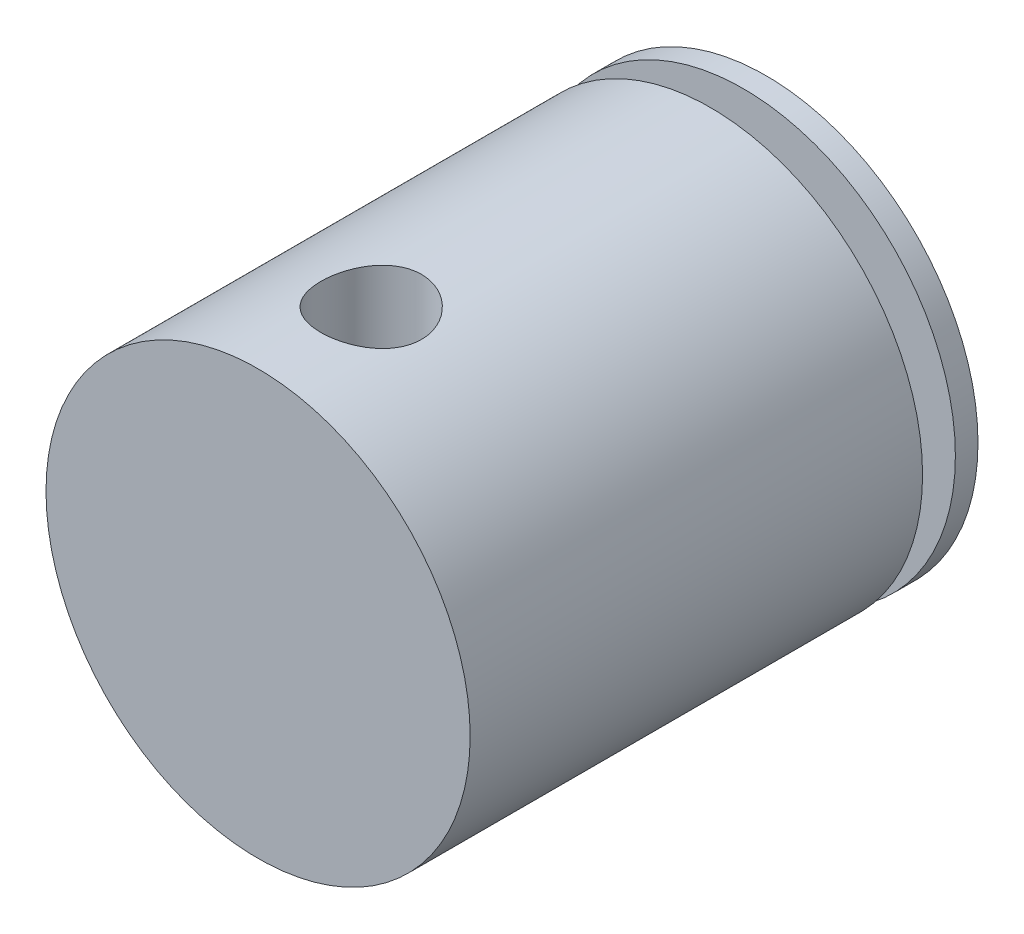
ISO-10303-21;
HEADER;
FILE_DESCRIPTION(('STEP AP214'),'2;1');
FILE_NAME('part.step','',(''),(''),'','','');
FILE_SCHEMA(('AUTOMOTIVE_DESIGN { 1 0 10303 214 1 1 1 1 }'));
ENDSEC;
DATA;
#1=APPLICATION_CONTEXT('core data for automotive mechanical design processes');
#2=APPLICATION_PROTOCOL_DEFINITION('international standard','automotive_design',2000,#1);
#3=PRODUCT_CONTEXT('',#1,'mechanical');
#4=PRODUCT('Part','Part','',(#3));
#5=PRODUCT_RELATED_PRODUCT_CATEGORY('part','',(#4));
#6=PRODUCT_DEFINITION_FORMATION('','',#4);
#7=PRODUCT_DEFINITION_CONTEXT('part definition',#1,'design');
#8=PRODUCT_DEFINITION('design','',#6,#7);
#9=PRODUCT_DEFINITION_SHAPE('','',#8);
#10=(LENGTH_UNIT() NAMED_UNIT(*) SI_UNIT(.MILLI.,.METRE.));
#11=(NAMED_UNIT(*) PLANE_ANGLE_UNIT() SI_UNIT($,.RADIAN.));
#12=(NAMED_UNIT(*) SI_UNIT($,.STERADIAN.) SOLID_ANGLE_UNIT());
#13=UNCERTAINTY_MEASURE_WITH_UNIT(LENGTH_MEASURE(1.E-05),#10,'distance_accuracy_value','');
#14=(GEOMETRIC_REPRESENTATION_CONTEXT(3) GLOBAL_UNCERTAINTY_ASSIGNED_CONTEXT((#13)) GLOBAL_UNIT_ASSIGNED_CONTEXT((#10,
#11,#12)) REPRESENTATION_CONTEXT('',''));
#15=CARTESIAN_POINT('',(0.,0.,0.));
#16=DIRECTION('',(0.,0.,1.));
#17=DIRECTION('',(1.,0.,0.));
#18=AXIS2_PLACEMENT_3D('',#15,#16,#17);
#19=CARTESIAN_POINT('',(0.,6.35,13.4366));
#20=DIRECTION('',(0.,-1.,0.));
#21=DIRECTION('',(0.,0.,-1.));
#22=AXIS2_PLACEMENT_3D('',#19,#20,#21);
#23=CYLINDRICAL_SURFACE('',#22,1.1303);
#24=CARTESIAN_POINT('',(0.632747022992577,1.89726519098149,12.50000548));
#25=CARTESIAN_POINT('',(0.584900384091897,1.91322023153208,12.4676836097554));
#26=CARTESIAN_POINT('',(0.534289547021317,1.92807974593231,12.4388357235473));
#27=CARTESIAN_POINT('',(0.428398847289024,1.95433793614678,12.3889930585579));
#28=CARTESIAN_POINT('',(0.373112896797203,1.96573200780675,12.3680087186983));
#29=CARTESIAN_POINT('',(0.258986731148002,1.98400039733528,12.3347621889654));
#30=CARTESIAN_POINT('',(0.200133362236899,1.99085671839388,12.3225347134511));
#31=CARTESIAN_POINT('',(0.080887997196954,1.99925142626344,12.307600560895));
#32=CARTESIAN_POINT('',(0.0204973438284298,2.00079430376887,12.3048858440438));
#33=CARTESIAN_POINT('',(-0.0958697663506059,1.99848935167467,12.308967704699));
#34=CARTESIAN_POINT('',(-0.151876162897505,1.99498814108088,12.3151526798096));
#35=CARTESIAN_POINT('',(-0.26193130348991,1.98354166038405,12.3356441747641));
#36=CARTESIAN_POINT('',(-0.315979140980776,1.97559435961155,12.3499544057128));
#37=CARTESIAN_POINT('',(-0.415618914149321,1.95692720364735,12.3842961410122));
#38=CARTESIAN_POINT('',(-0.461521104612107,1.94655405453876,12.4036321442156));
#39=CARTESIAN_POINT('',(-0.549861794115694,1.92346411692876,12.4478317185058));
#40=CARTESIAN_POINT('',(-0.592306364939444,1.91075157038218,12.4726853013118));
#41=CARTESIAN_POINT('',(-0.637878132503795,1.8955540395575,12.5034718634731));
#42=CARTESIAN_POINT('',(-0.64297698197121,1.89383043056443,12.5069779555065));
#43=CARTESIAN_POINT('',(-0.697195859847934,1.87525925626147,12.544920111092));
#44=CARTESIAN_POINT('',(-0.743419872006707,1.85727605918662,12.583105569346));
#45=CARTESIAN_POINT('',(-0.829247531867213,1.82058382274504,12.6662010561856));
#46=CARTESIAN_POINT('',(-0.868828452865083,1.80187255102614,12.7111332112984));
#47=CARTESIAN_POINT('',(-0.94436564099008,1.76355590563589,12.812000708802));
#48=CARTESIAN_POINT('',(-0.979507332424796,1.7440623349803,12.8685956926486));
#49=CARTESIAN_POINT('',(-1.03960286638491,1.70892622200437,12.9879891279861));
#50=CARTESIAN_POINT('',(-1.06457705785885,1.69327601286059,13.050774873313));
#51=CARTESIAN_POINT('',(-1.098929150276,1.67112600818607,13.1668572927225));
#52=CARTESIAN_POINT('',(-1.11051389830127,1.66337828843511,13.2192623034488));
#53=CARTESIAN_POINT('',(-1.12612343677336,1.65285291934652,13.3256606745058));
#54=CARTESIAN_POINT('',(-1.1301553654785,1.6500705772899,13.3796524860526));
#55=CARTESIAN_POINT('',(-1.13043715047446,1.64987752484841,13.487730079154));
#56=CARTESIAN_POINT('',(-1.12667756014645,1.65247333505932,13.5418158952475));
#57=CARTESIAN_POINT('',(-1.11157754288237,1.66266619280544,13.6484431824394));
#58=CARTESIAN_POINT('',(-1.100232114612,1.67026653977576,13.7009836107914));
#59=CARTESIAN_POINT('',(-1.07054504152151,1.68944513796008,13.8031196292429));
#60=CARTESIAN_POINT('',(-1.0522186017744,1.70101473849171,13.8527213506099));
#61=CARTESIAN_POINT('',(-1.00920142922363,1.72688308042955,13.9483039661418));
#62=CARTESIAN_POINT('',(-0.984508238216253,1.74118287540965,13.9942834527893));
#63=CARTESIAN_POINT('',(-0.924975356452469,1.77361896820926,14.0889789450019));
#64=CARTESIAN_POINT('',(-0.889151371211982,1.79200513320679,14.1369914483872));
#65=CARTESIAN_POINT('',(-0.810416620819579,1.82896223030409,14.2267725408132));
#66=CARTESIAN_POINT('',(-0.767499984114396,1.84753330340604,14.2685359015461));
#67=CARTESIAN_POINT('',(-0.670192119143001,1.88516083595998,14.3491971609545));
#68=CARTESIAN_POINT('',(-0.615060462129677,1.90405024434802,14.3872888348615));
#69=CARTESIAN_POINT('',(-0.498012866760856,1.93795493216013,14.4534934723028));
#70=CARTESIAN_POINT('',(-0.436101329040119,1.9529727035706,14.4816128589192));
#71=CARTESIAN_POINT('',(-0.311721642094349,1.97649520206688,14.5249169777376));
#72=CARTESIAN_POINT('',(-0.249595332293254,1.98538202079653,14.5408688726066));
#73=CARTESIAN_POINT('',(-0.123004674697715,1.99721829312216,14.5620130807818));
#74=CARTESIAN_POINT('',(-0.0585425924869632,2.00017335117725,14.5672155505199));
#75=CARTESIAN_POINT('',(0.062656316325467,1.99982343891763,14.5665931304865));
#76=CARTESIAN_POINT('',(0.11940625274167,1.99721667382654,14.561998206934));
#77=CARTESIAN_POINT('',(0.231178401450847,1.9873819760345,14.5444511656826));
#78=CARTESIAN_POINT('',(0.286200573368808,1.98015393542614,14.5314988528375));
#79=CARTESIAN_POINT('',(0.39268012554943,1.96180713715722,14.4979556513084));
#80=CARTESIAN_POINT('',(0.444161277657743,1.95071815775145,14.4774231551946));
#81=CARTESIAN_POINT('',(0.542991764074165,1.9255512955034,14.4294536218916));
#82=CARTESIAN_POINT('',(0.590340054023559,1.91147266025393,14.4020148462752));
#83=CARTESIAN_POINT('',(0.684849276287175,1.87981369631761,14.3377961124724));
#84=CARTESIAN_POINT('',(0.73148068874315,1.86202158583996,14.3003422057888));
#85=CARTESIAN_POINT('',(0.818158186611846,1.82560032678445,14.2187410604893));
#86=CARTESIAN_POINT('',(0.85819673684821,1.80697025099829,14.1745862724416));
#87=CARTESIAN_POINT('',(0.934916056666968,1.76859979097864,14.0752399898408));
#88=CARTESIAN_POINT('',(0.970775937983855,1.74895467301229,14.0193726728626));
#89=CARTESIAN_POINT('',(1.0324848313806,1.71325304331154,13.9013284900559));
#90=CARTESIAN_POINT('',(1.05834754691328,1.69719163213678,13.8391604095924));
#91=CARTESIAN_POINT('',(1.09452901881329,1.67402230547819,13.7237058222529));
#92=CARTESIAN_POINT('',(1.10697898900077,1.66573892427135,13.6713239161826));
#93=CARTESIAN_POINT('',(1.1242974383978,1.65410165857857,13.5648056619592));
#94=CARTESIAN_POINT('',(1.12917398487469,1.65074252895743,13.5106712434536));
#95=CARTESIAN_POINT('',(1.1310795961398,1.64943773149513,13.4021029796586));
#96=CARTESIAN_POINT('',(1.12809498489799,1.65150149783334,13.34766877717));
#97=CARTESIAN_POINT('',(1.11442794670077,1.66075255307469,13.240218649075));
#98=CARTESIAN_POINT('',(1.10374150993568,1.66794251081139,13.1872034771777));
#99=CARTESIAN_POINT('',(1.07537770864858,1.68636450680459,13.0845382150516));
#100=CARTESIAN_POINT('',(1.05778306281021,1.697548581326,13.034856168786));
#101=CARTESIAN_POINT('',(1.01621519753425,1.72275363069331,12.9389865147877));
#102=CARTESIAN_POINT('',(0.99223600618508,1.73677725861526,12.8928022309764));
#103=CARTESIAN_POINT('',(0.934321406956702,1.76869482931024,12.7977089775022));
#104=CARTESIAN_POINT('',(0.899421232332614,1.78685218118729,12.7494766079105));
#105=CARTESIAN_POINT('',(0.822641853733916,1.82347117608623,12.6592060295683));
#106=CARTESIAN_POINT('',(0.780774402611069,1.84193226027511,12.6171576106256));
#107=CARTESIAN_POINT('',(0.70304308462539,1.87268672022497,12.5505041857258));
#108=CARTESIAN_POINT('',(0.66867431918063,1.8852847994488,12.5242754691217));
#109=CARTESIAN_POINT('',(0.632747022992577,1.89726519098149,12.50000548));
#110=B_SPLINE_CURVE_WITH_KNOTS('',3,(#24,#25,#26,#27,#28,#29,#30,#31,#32,#33,#34,#35,#36,#37,
#38,#39,#40,#41,#42,#43,#44,#45,#46,#47,#48,#49,#50,#51,#52,#53,#54,#55,#56,#57,#58,#59,#60,#61,
#62,#63,#64,#65,#66,#67,#68,#69,#70,#71,#72,#73,#74,#75,#76,#77,#78,#79,#80,#81,#82,#83,#84,#85,
#86,#87,#88,#89,#90,#91,#92,#93,#94,#95,#96,#97,#98,#99,#100,#101,#102,#103,#104,#105,#106,#107,
#108,#109),.UNSPECIFIED.,.T.,.F.,(4,2,2,2,2,2,2,2,2,2,2,2,2,2,2,2,2,2,2,2,2,2,2,2,2,2,2,2,2,2,2,
2,2,2,2,2,2,2,2,2,2,2,4),(0.,0.179586584175892,0.359410733480006,0.539943862083115,
0.720324374338658,0.888884851848265,1.05752237916461,1.20968525886804,1.3615748975831,
1.38084665050172,1.56776038509219,1.75530108263773,1.96249593717728,2.16927405477266,
2.33124806623797,2.4930689167748,2.65508607744691,2.81721016131446,2.97898312951322,
3.14081865205979,3.32805940938032,3.51545595502382,3.72324267489828,3.93089531665479,
4.12402330624869,4.3169687381834,4.48712343381739,4.65728210273182,4.82615644275631,
4.99507333388996,5.18152246315155,5.36818323330793,5.57486681410519,5.78126607350657,
5.94398659181126,6.10653365983107,6.26936369714682,6.43227857013588,6.59329944573043,
6.75447146776875,6.94047652363428,7.12617093691003,7.261019706841),.UNSPECIFIED.);
#111=CARTESIAN_POINT('',(0.632747022992577,1.89726519098149,12.50000548));
#112=VERTEX_POINT('',#111);
#113=EDGE_CURVE('E10',#112,#112,#110,.T.);
#114=ORIENTED_EDGE('',*,*,#113,.F.);
#115=EDGE_LOOP('',(#114));
#116=FACE_BOUND('',#115,.T.);
#117=CARTESIAN_POINT('',(0.,4.7625,12.3063));
#118=CARTESIAN_POINT('',(-0.0625504471650141,4.76249888658254,12.3063019276085));
#119=CARTESIAN_POINT('',(-0.125123129283414,4.76125531619252,12.3115097817071));
#120=CARTESIAN_POINT('',(-0.248481844038289,4.75641479439014,12.3321764396431));
#121=CARTESIAN_POINT('',(-0.309266728250474,4.75281636336277,12.3476416885284));
#122=CARTESIAN_POINT('',(-0.427250047842577,4.74366551356278,12.3883041375215));
#123=CARTESIAN_POINT('',(-0.484452471724358,4.73811531503235,12.4134902827412));
#124=CARTESIAN_POINT('',(-0.593819309373726,4.72565533763748,12.4728422515937));
#125=CARTESIAN_POINT('',(-0.64598367695744,4.71874554631143,12.5070081575333));
#126=CARTESIAN_POINT('',(-0.744769781920519,4.70417494660862,12.5840251121215));
#127=CARTESIAN_POINT('',(-0.791283867055919,4.69650348465821,12.6270122351177));
#128=CARTESIAN_POINT('',(-0.876514301242985,4.68134670992166,12.7201597081509));
#129=CARTESIAN_POINT('',(-0.915229851617918,4.67386141627045,12.7703207920009));
#130=CARTESIAN_POINT('',(-0.984257303274577,4.65981813018725,12.8772113977317));
#131=CARTESIAN_POINT('',(-1.01445122919644,4.6532737183417,12.9340190505402));
#132=CARTESIAN_POINT('',(-1.06482048280172,4.64200756588757,13.0520837123328));
#133=CARTESIAN_POINT('',(-1.08499723988879,4.63728556525076,13.1133400850745));
#134=CARTESIAN_POINT('',(-1.11439695837541,4.63030798184956,13.2373860966354));
#135=CARTESIAN_POINT('',(-1.12381226659385,4.62800914824604,13.3001276604933));
#136=CARTESIAN_POINT('',(-1.13202052695981,4.62600854277725,13.4263386764494));
#137=CARTESIAN_POINT('',(-1.13081502726521,4.62630639240253,13.4898080211146));
#138=CARTESIAN_POINT('',(-1.11796991019264,4.62942650333921,13.6142176487548));
#139=CARTESIAN_POINT('',(-1.10655703472154,4.63219390421103,13.6751829305462));
#140=CARTESIAN_POINT('',(-1.07398179717216,4.63985416565765,13.7943079068008));
#141=CARTESIAN_POINT('',(-1.05281880205468,4.64474716423846,13.8524674188249));
#142=CARTESIAN_POINT('',(-1.00114461591174,4.65615920388045,13.9649502308673));
#143=CARTESIAN_POINT('',(-0.970549092235666,4.66269281104616,14.0192332491175));
#144=CARTESIAN_POINT('',(-0.900937448372107,4.6766413798207,14.1219771959224));
#145=CARTESIAN_POINT('',(-0.861919990000872,4.68405648140832,14.1704371973354));
#146=CARTESIAN_POINT('',(-0.775386694919824,4.69916539760802,14.2614615109683));
#147=CARTESIAN_POINT('',(-0.727678881710192,4.70686148789115,14.3038431496225));
#148=CARTESIAN_POINT('',(-0.62574265459869,4.72149336042035,14.3800369726125));
#149=CARTESIAN_POINT('',(-0.571514078356703,4.72842912372918,14.4138489435339));
#150=CARTESIAN_POINT('',(-0.457830918707983,4.7407880498009,14.4720013650433));
#151=CARTESIAN_POINT('',(-0.398361889110952,4.7462068476709,14.49631456182));
#152=CARTESIAN_POINT('',(-0.276024255491215,4.75488931700388,14.5345498440921));
#153=CARTESIAN_POINT('',(-0.213156237830652,4.75815335891023,14.5484737157628));
#154=CARTESIAN_POINT('',(-0.0873691590361529,4.76210460266796,14.5652617208301));
#155=CARTESIAN_POINT('',(-0.0244851159606706,4.76284982691246,14.5683749309216));
#156=CARTESIAN_POINT('',(0.100904914262536,4.76184360723796,14.5641330105785));
#157=CARTESIAN_POINT('',(0.16341093147156,4.76009236453545,14.5567787238294));
#158=CARTESIAN_POINT('',(0.285421966304749,4.7543269344029,14.5320164653175));
#159=CARTESIAN_POINT('',(0.344955665814234,4.75034285425274,14.5147421786054));
#160=CARTESIAN_POINT('',(0.460278770394104,4.74055923690497,14.4707811543474));
#161=CARTESIAN_POINT('',(0.516067819691339,4.73475952750301,14.4440935239573));
#162=CARTESIAN_POINT('',(0.623325436186189,4.72184709836335,14.3815655374685));
#163=CARTESIAN_POINT('',(0.674708549514261,4.71471447952687,14.3455828028546));
#164=CARTESIAN_POINT('',(0.770796159921669,4.69996242077331,14.2656702732492));
#165=CARTESIAN_POINT('',(0.81549962259093,4.69234290571582,14.2217392497106));
#166=CARTESIAN_POINT('',(0.897968165505128,4.6772704338935,14.1260258874936));
#167=CARTESIAN_POINT('',(0.935559392964994,4.66982480514445,14.0740923671793));
#168=CARTESIAN_POINT('',(1.00149022808019,4.65613164810589,13.9645050438674));
#169=CARTESIAN_POINT('',(1.0298302497261,4.64988406620905,13.906851496991));
#170=CARTESIAN_POINT('',(1.07624913236191,4.63935996173661,13.7877754030212));
#171=CARTESIAN_POINT('',(1.0943883213257,4.63507187952516,13.7263774471342));
#172=CARTESIAN_POINT('',(1.12005827002546,4.62893650286401,13.6012877932594));
#173=CARTESIAN_POINT('',(1.12759108086313,4.62708873650105,13.537596541202));
#174=CARTESIAN_POINT('',(1.13173541942955,4.62607660378741,13.4114902196367));
#175=CARTESIAN_POINT('',(1.12862381464116,4.62684420801562,13.3490846415471));
#176=CARTESIAN_POINT('',(1.11219513075476,4.63082047949845,13.225714932912));
#177=CARTESIAN_POINT('',(1.09887821898312,4.63402910673,13.1647507787498));
#178=CARTESIAN_POINT('',(1.06256106322215,4.64248992098927,13.046261431108));
#179=CARTESIAN_POINT('',(1.03960787796393,4.64773216751233,12.9887210561912));
#180=CARTESIAN_POINT('',(0.984707919621944,4.65967190423072,12.8782692678741));
#181=CARTESIAN_POINT('',(0.952760024881786,4.66636957589639,12.8253584328649));
#182=CARTESIAN_POINT('',(0.879888490013006,4.68066337542781,12.7243182791499));
#183=CARTESIAN_POINT('',(0.838770514374275,4.68827700003746,12.6763315675736));
#184=CARTESIAN_POINT('',(0.749111183772158,4.7034351287937,12.5878488324981));
#185=CARTESIAN_POINT('',(0.700568092234972,4.710979616332,12.5473545662278));
#186=CARTESIAN_POINT('',(0.596506539598594,4.72529205111388,12.4743836431116));
#187=CARTESIAN_POINT('',(0.540889568123423,4.73204576758136,12.4420444881268));
#188=CARTESIAN_POINT('',(0.424856108392299,4.74386898028089,12.3872260472068));
#189=CARTESIAN_POINT('',(0.364443352132301,4.7489397705207,12.3647391815334));
#190=CARTESIAN_POINT('',(0.253386137402231,4.75601012346783,12.3338864600197));
#191=CARTESIAN_POINT('',(0.203302998812329,4.75842781496556,12.3235627629292));
#192=CARTESIAN_POINT('',(0.102151476578725,4.76167315947544,12.3097689544463));
#193=CARTESIAN_POINT('',(0.0510831531122653,4.76250090929606,12.3062984257775));
#194=CARTESIAN_POINT('',(0.,4.7625,12.3063));
#195=B_SPLINE_CURVE_WITH_KNOTS('',3,(#117,#118,#119,#120,#121,#122,#123,#124,#125,#126,#127,
#128,#129,#130,#131,#132,#133,#134,#135,#136,#137,#138,#139,#140,#141,#142,#143,#144,#145,#146,
#147,#148,#149,#150,#151,#152,#153,#154,#155,#156,#157,#158,#159,#160,#161,#162,#163,#164,#165,
#166,#167,#168,#169,#170,#171,#172,#173,#174,#175,#176,#177,#178,#179,#180,#181,#182,#183,#184,
#185,#186,#187,#188,#189,#190,#191,#192,#193,#194),.UNSPECIFIED.,.T.,.F.,(4,2,2,2,2,2,2,2,2,2,2,
2,2,2,2,2,2,2,2,2,2,2,2,2,2,2,2,2,2,2,2,2,2,2,2,2,2,2,4),(0.,0.187464233445308,
0.375046368371234,0.562415804978719,0.749786959039266,0.940301149532557,1.13083484137835,
1.323889669599,1.51691694186557,1.70643733003011,1.89593009293011,2.08131531006457,
2.26671256527165,2.4538179686575,2.64095312363527,2.83287860741468,3.02480887033709,
3.21728584337239,3.4097297173464,3.59770916783967,3.78567346795128,3.97116223372724,
4.15666859761835,4.34520498082457,4.53377053056524,4.72647545534149,4.9191717554081,
5.11071612615483,5.30222345023359,5.48878783947735,5.67534916987401,5.86100983556771,
6.04669366374175,6.23676713117169,6.4268851208331,6.6200215835062,6.81300919697153,
6.96611517316015,7.11921182672838),.UNSPECIFIED.);
#196=CARTESIAN_POINT('',(0.,4.7625,12.3063));
#197=VERTEX_POINT('',#196);
#198=EDGE_CURVE('E105',#197,#197,#195,.T.);
#199=ORIENTED_EDGE('',*,*,#198,.T.);
#200=EDGE_LOOP('',(#199));
#201=FACE_BOUND('',#200,.T.);
#202=ADVANCED_FACE('F37',(#116,#201),#23,.F.);
#203=CARTESIAN_POINT('',(0.,0.,5.08));
#204=DIRECTION('',(0.,0.,-1.));
#205=DIRECTION('',(-1.,0.,0.));
#206=AXIS2_PLACEMENT_3D('',#203,#204,#205);
#207=CYLINDRICAL_SURFACE('',#206,4.7625);
#208=CARTESIAN_POINT('',(0.,0.,5.08));
#209=DIRECTION('',(0.,0.,1.));
#210=DIRECTION('',(1.,0.,0.));
#211=AXIS2_PLACEMENT_3D('',#208,#209,#210);
#212=CIRCLE('',#211,4.7625);
#213=CARTESIAN_POINT('',(4.7625,0.,5.08));
#214=VERTEX_POINT('',#213);
#215=EDGE_CURVE('E117',#214,#214,#212,.T.);
#216=ORIENTED_EDGE('',*,*,#215,.F.);
#217=EDGE_LOOP('',(#216));
#218=FACE_BOUND('',#217,.T.);
#219=CARTESIAN_POINT('',(0.,0.,4.572));
#220=DIRECTION('',(0.,0.,-1.));
#221=DIRECTION('',(-1.,0.,0.));
#222=AXIS2_PLACEMENT_3D('',#219,#220,#221);
#223=CIRCLE('',#222,4.7625);
#224=CARTESIAN_POINT('',(-4.7625,0.,4.572));
#225=VERTEX_POINT('',#224);
#226=EDGE_CURVE('E112',#225,#225,#223,.T.);
#227=ORIENTED_EDGE('',*,*,#226,.F.);
#228=EDGE_LOOP('',(#227));
#229=FACE_BOUND('',#228,.T.);
#230=ADVANCED_FACE('F39',(#218,#229),#207,.T.);
#231=CARTESIAN_POINT('',(0.,0.,12.50000548));
#232=DIRECTION('',(0.,0.,-1.));
#233=DIRECTION('',(-1.,0.,0.));
#234=AXIS2_PLACEMENT_3D('',#231,#232,#233);
#235=CYLINDRICAL_SURFACE('',#234,1.999996);
#236=CARTESIAN_POINT('',(-0.632747022992577,-1.89726519098149,12.50000548));
#237=CARTESIAN_POINT('',(-0.584900384091897,-1.91322023153208,12.4676836097554));
#238=CARTESIAN_POINT('',(-0.534289547021317,-1.92807974593231,12.4388357235473));
#239=CARTESIAN_POINT('',(-0.428398847289024,-1.95433793614678,12.3889930585579));
#240=CARTESIAN_POINT('',(-0.373112896797203,-1.96573200780675,12.3680087186983));
#241=CARTESIAN_POINT('',(-0.258986731148002,-1.98400039733528,12.3347621889654));
#242=CARTESIAN_POINT('',(-0.200133362236899,-1.99085671839388,12.3225347134511));
#243=CARTESIAN_POINT('',(-0.080887997196954,-1.99925142626344,12.307600560895));
#244=CARTESIAN_POINT('',(-0.0204973438284298,-2.00079430376887,12.3048858440438));
#245=CARTESIAN_POINT('',(0.0958697663506059,-1.99848935167467,12.308967704699));
#246=CARTESIAN_POINT('',(0.151876162897505,-1.99498814108088,12.3151526798096));
#247=CARTESIAN_POINT('',(0.26193130348991,-1.98354166038405,12.3356441747641));
#248=CARTESIAN_POINT('',(0.315979140980776,-1.97559435961155,12.3499544057128));
#249=CARTESIAN_POINT('',(0.415618914149321,-1.95692720364735,12.3842961410122));
#250=CARTESIAN_POINT('',(0.461521104612107,-1.94655405453876,12.4036321442156));
#251=CARTESIAN_POINT('',(0.549861794115694,-1.92346411692876,12.4478317185058));
#252=CARTESIAN_POINT('',(0.592306364939444,-1.91075157038218,12.4726853013118));
#253=CARTESIAN_POINT('',(0.637878132503795,-1.8955540395575,12.5034718634731));
#254=CARTESIAN_POINT('',(0.64297698197121,-1.89383043056443,12.5069779555065));
#255=CARTESIAN_POINT('',(0.697195859847934,-1.87525925626147,12.544920111092));
#256=CARTESIAN_POINT('',(0.743419872006707,-1.85727605918662,12.583105569346));
#257=CARTESIAN_POINT('',(0.829247531867213,-1.82058382274504,12.6662010561856));
#258=CARTESIAN_POINT('',(0.868828452865083,-1.80187255102614,12.7111332112984));
#259=CARTESIAN_POINT('',(0.94436564099008,-1.76355590563589,12.812000708802));
#260=CARTESIAN_POINT('',(0.979507332424796,-1.7440623349803,12.8685956926486));
#261=CARTESIAN_POINT('',(1.03960286638491,-1.70892622200437,12.9879891279861));
#262=CARTESIAN_POINT('',(1.06457705785885,-1.69327601286059,13.050774873313));
#263=CARTESIAN_POINT('',(1.098929150276,-1.67112600818607,13.1668572927225));
#264=CARTESIAN_POINT('',(1.11051389830127,-1.66337828843511,13.2192623034488));
#265=CARTESIAN_POINT('',(1.12612343677336,-1.65285291934652,13.3256606745058));
#266=CARTESIAN_POINT('',(1.1301553654785,-1.6500705772899,13.3796524860526));
#267=CARTESIAN_POINT('',(1.13043715047446,-1.64987752484841,13.487730079154));
#268=CARTESIAN_POINT('',(1.12667756014645,-1.65247333505932,13.5418158952475));
#269=CARTESIAN_POINT('',(1.11157754288237,-1.66266619280544,13.6484431824394));
#270=CARTESIAN_POINT('',(1.100232114612,-1.67026653977576,13.7009836107914));
#271=CARTESIAN_POINT('',(1.07054504152151,-1.68944513796008,13.8031196292429));
#272=CARTESIAN_POINT('',(1.0522186017744,-1.70101473849171,13.8527213506099));
#273=CARTESIAN_POINT('',(1.00920142922363,-1.72688308042955,13.9483039661418));
#274=CARTESIAN_POINT('',(0.984508238216253,-1.74118287540965,13.9942834527893));
#275=CARTESIAN_POINT('',(0.924975356452469,-1.77361896820926,14.0889789450019));
#276=CARTESIAN_POINT('',(0.889151371211982,-1.79200513320679,14.1369914483872));
#277=CARTESIAN_POINT('',(0.810416620819579,-1.82896223030409,14.2267725408132));
#278=CARTESIAN_POINT('',(0.767499984114396,-1.84753330340604,14.2685359015461));
#279=CARTESIAN_POINT('',(0.670192119143001,-1.88516083595998,14.3491971609545));
#280=CARTESIAN_POINT('',(0.615060462129677,-1.90405024434802,14.3872888348615));
#281=CARTESIAN_POINT('',(0.498012866760856,-1.93795493216013,14.4534934723028));
#282=CARTESIAN_POINT('',(0.436101329040119,-1.9529727035706,14.4816128589192));
#283=CARTESIAN_POINT('',(0.311721642094349,-1.97649520206688,14.5249169777376));
#284=CARTESIAN_POINT('',(0.249595332293254,-1.98538202079653,14.5408688726066));
#285=CARTESIAN_POINT('',(0.123004674697715,-1.99721829312216,14.5620130807818));
#286=CARTESIAN_POINT('',(0.0585425924869632,-2.00017335117725,14.5672155505199));
#287=CARTESIAN_POINT('',(-0.062656316325467,-1.99982343891763,14.5665931304865));
#288=CARTESIAN_POINT('',(-0.11940625274167,-1.99721667382654,14.561998206934));
#289=CARTESIAN_POINT('',(-0.231178401450847,-1.9873819760345,14.5444511656826));
#290=CARTESIAN_POINT('',(-0.286200573368808,-1.98015393542614,14.5314988528375));
#291=CARTESIAN_POINT('',(-0.39268012554943,-1.96180713715722,14.4979556513084));
#292=CARTESIAN_POINT('',(-0.444161277657743,-1.95071815775145,14.4774231551946));
#293=CARTESIAN_POINT('',(-0.542991764074165,-1.9255512955034,14.4294536218916));
#294=CARTESIAN_POINT('',(-0.590340054023559,-1.91147266025393,14.4020148462752));
#295=CARTESIAN_POINT('',(-0.684849276287175,-1.87981369631761,14.3377961124724));
#296=CARTESIAN_POINT('',(-0.73148068874315,-1.86202158583996,14.3003422057888));
#297=CARTESIAN_POINT('',(-0.818158186611846,-1.82560032678445,14.2187410604893));
#298=CARTESIAN_POINT('',(-0.85819673684821,-1.80697025099829,14.1745862724416));
#299=CARTESIAN_POINT('',(-0.934916056666968,-1.76859979097864,14.0752399898408));
#300=CARTESIAN_POINT('',(-0.970775937983855,-1.74895467301229,14.0193726728626));
#301=CARTESIAN_POINT('',(-1.0324848313806,-1.71325304331154,13.9013284900559));
#302=CARTESIAN_POINT('',(-1.05834754691328,-1.69719163213678,13.8391604095924));
#303=CARTESIAN_POINT('',(-1.09452901881329,-1.67402230547819,13.7237058222529));
#304=CARTESIAN_POINT('',(-1.10697898900077,-1.66573892427135,13.6713239161826));
#305=CARTESIAN_POINT('',(-1.1242974383978,-1.65410165857857,13.5648056619592));
#306=CARTESIAN_POINT('',(-1.12917398487469,-1.65074252895743,13.5106712434536));
#307=CARTESIAN_POINT('',(-1.1310795961398,-1.64943773149513,13.4021029796586));
#308=CARTESIAN_POINT('',(-1.12809498489799,-1.65150149783334,13.34766877717));
#309=CARTESIAN_POINT('',(-1.11442794670077,-1.66075255307469,13.240218649075));
#310=CARTESIAN_POINT('',(-1.10374150993568,-1.66794251081139,13.1872034771777));
#311=CARTESIAN_POINT('',(-1.07537770864858,-1.68636450680459,13.0845382150516));
#312=CARTESIAN_POINT('',(-1.05778306281021,-1.697548581326,13.034856168786));
#313=CARTESIAN_POINT('',(-1.01621519753425,-1.72275363069331,12.9389865147877));
#314=CARTESIAN_POINT('',(-0.99223600618508,-1.73677725861526,12.8928022309764));
#315=CARTESIAN_POINT('',(-0.934321406956702,-1.76869482931024,12.7977089775022));
#316=CARTESIAN_POINT('',(-0.899421232332614,-1.78685218118729,12.7494766079105));
#317=CARTESIAN_POINT('',(-0.822641853733916,-1.82347117608623,12.6592060295683));
#318=CARTESIAN_POINT('',(-0.780774402611069,-1.84193226027511,12.6171576106256));
#319=CARTESIAN_POINT('',(-0.70304308462539,-1.87268672022497,12.5505041857258));
#320=CARTESIAN_POINT('',(-0.66867431918063,-1.8852847994488,12.5242754691217));
#321=CARTESIAN_POINT('',(-0.632747022992577,-1.89726519098149,12.50000548));
#322=B_SPLINE_CURVE_WITH_KNOTS('',3,(#236,#237,#238,#239,#240,#241,#242,#243,#244,#245,#246,
#247,#248,#249,#250,#251,#252,#253,#254,#255,#256,#257,#258,#259,#260,#261,#262,#263,#264,#265,
#266,#267,#268,#269,#270,#271,#272,#273,#274,#275,#276,#277,#278,#279,#280,#281,#282,#283,#284,
#285,#286,#287,#288,#289,#290,#291,#292,#293,#294,#295,#296,#297,#298,#299,#300,#301,#302,#303,
#304,#305,#306,#307,#308,#309,#310,#311,#312,#313,#314,#315,#316,#317,#318,#319,#320,#321),
.UNSPECIFIED.,.T.,.F.,(4,2,2,2,2,2,2,2,2,2,2,2,2,2,2,2,2,2,2,2,2,2,2,2,2,2,2,2,2,2,2,2,2,2,2,2,
2,2,2,2,2,2,4),(0.,0.179586584175892,0.359410733480006,0.539943862083115,0.720324374338658,
0.888884851848265,1.05752237916461,1.20968525886804,1.3615748975831,1.38084665050172,
1.56776038509219,1.75530108263773,1.96249593717728,2.16927405477266,2.33124806623797,
2.4930689167748,2.65508607744691,2.81721016131446,2.97898312951322,3.14081865205979,
3.32805940938032,3.51545595502382,3.72324267489828,3.93089531665479,4.12402330624869,
4.3169687381834,4.48712343381739,4.65728210273182,4.82615644275631,4.99507333388996,
5.18152246315155,5.36818323330793,5.57486681410519,5.78126607350657,5.94398659181126,
6.10653365983107,6.26936369714682,6.43227857013588,6.59329944573043,6.75447146776875,
6.94047652363428,7.12617093691003,7.261019706841),.UNSPECIFIED.);
#323=CARTESIAN_POINT('',(-0.632747022992577,-1.89726519098149,12.50000548));
#324=VERTEX_POINT('',#323);
#325=EDGE_CURVE('E46',#324,#324,#322,.T.);
#326=ORIENTED_EDGE('',*,*,#325,.T.);
#327=EDGE_LOOP('',(#326));
#328=FACE_BOUND('',#327,.T.);
#329=ORIENTED_EDGE('',*,*,#113,.T.);
#330=EDGE_LOOP('',(#329));
#331=FACE_BOUND('',#330,.T.);
#332=CARTESIAN_POINT('',(0.,0.,4.572));
#333=DIRECTION('',(0.,0.,-1.));
#334=DIRECTION('',(-1.,0.,0.));
#335=AXIS2_PLACEMENT_3D('',#332,#333,#334);
#336=CIRCLE('',#335,1.999996);
#337=CARTESIAN_POINT('',(-1.999996,0.,4.572));
#338=VERTEX_POINT('',#337);
#339=EDGE_CURVE('E41',#338,#338,#336,.F.);
#340=ORIENTED_EDGE('',*,*,#339,.F.);
#341=EDGE_LOOP('',(#340));
#342=FACE_BOUND('',#341,.T.);
#343=CARTESIAN_POINT('',(0.,0.,14.5720054));
#344=DIRECTION('',(0.,0.,-1.));
#345=DIRECTION('',(-1.,0.,0.));
#346=AXIS2_PLACEMENT_3D('',#343,#344,#345);
#347=CIRCLE('',#346,1.999996);
#348=CARTESIAN_POINT('',(-1.999996,0.,14.5720054));
#349=VERTEX_POINT('',#348);
#350=EDGE_CURVE('E158',#349,#349,#347,.T.);
#351=ORIENTED_EDGE('',*,*,#350,.F.);
#352=EDGE_LOOP('',(#351));
#353=FACE_BOUND('',#352,.T.);
#354=ADVANCED_FACE('F65',(#328,#331,#342,#353),#235,.F.);
#355=ORIENTED_EDGE('',*,*,#325,.F.);
#356=EDGE_LOOP('',(#355));
#357=FACE_BOUND('',#356,.T.);
#358=CARTESIAN_POINT('',(0.,-4.7625,12.3063));
#359=CARTESIAN_POINT('',(0.0625504471650141,-4.76249888658254,12.3063019276085));
#360=CARTESIAN_POINT('',(0.125123129283414,-4.76125531619252,12.3115097817071));
#361=CARTESIAN_POINT('',(0.248481844038289,-4.75641479439014,12.3321764396431));
#362=CARTESIAN_POINT('',(0.309266728250474,-4.75281636336277,12.3476416885284));
#363=CARTESIAN_POINT('',(0.427250047842577,-4.74366551356278,12.3883041375215));
#364=CARTESIAN_POINT('',(0.484452471724358,-4.73811531503235,12.4134902827412));
#365=CARTESIAN_POINT('',(0.593819309373726,-4.72565533763748,12.4728422515937));
#366=CARTESIAN_POINT('',(0.64598367695744,-4.71874554631143,12.5070081575333));
#367=CARTESIAN_POINT('',(0.744769781920519,-4.70417494660862,12.5840251121215));
#368=CARTESIAN_POINT('',(0.791283867055919,-4.69650348465821,12.6270122351177));
#369=CARTESIAN_POINT('',(0.876514301242985,-4.68134670992166,12.7201597081509));
#370=CARTESIAN_POINT('',(0.915229851617918,-4.67386141627045,12.7703207920009));
#371=CARTESIAN_POINT('',(0.984257303274577,-4.65981813018725,12.8772113977317));
#372=CARTESIAN_POINT('',(1.01445122919644,-4.6532737183417,12.9340190505402));
#373=CARTESIAN_POINT('',(1.06482048280172,-4.64200756588757,13.0520837123328));
#374=CARTESIAN_POINT('',(1.08499723988879,-4.63728556525076,13.1133400850745));
#375=CARTESIAN_POINT('',(1.11439695837541,-4.63030798184956,13.2373860966354));
#376=CARTESIAN_POINT('',(1.12381226659385,-4.62800914824604,13.3001276604933));
#377=CARTESIAN_POINT('',(1.13202052695981,-4.62600854277725,13.4263386764494));
#378=CARTESIAN_POINT('',(1.13081502726521,-4.62630639240253,13.4898080211146));
#379=CARTESIAN_POINT('',(1.11796991019264,-4.62942650333921,13.6142176487548));
#380=CARTESIAN_POINT('',(1.10655703472154,-4.63219390421103,13.6751829305462));
#381=CARTESIAN_POINT('',(1.07398179717216,-4.63985416565765,13.7943079068008));
#382=CARTESIAN_POINT('',(1.05281880205468,-4.64474716423846,13.8524674188249));
#383=CARTESIAN_POINT('',(1.00114461591174,-4.65615920388045,13.9649502308673));
#384=CARTESIAN_POINT('',(0.970549092235666,-4.66269281104616,14.0192332491175));
#385=CARTESIAN_POINT('',(0.900937448372107,-4.6766413798207,14.1219771959224));
#386=CARTESIAN_POINT('',(0.861919990000872,-4.68405648140832,14.1704371973354));
#387=CARTESIAN_POINT('',(0.775386694919824,-4.69916539760802,14.2614615109683));
#388=CARTESIAN_POINT('',(0.727678881710192,-4.70686148789115,14.3038431496225));
#389=CARTESIAN_POINT('',(0.62574265459869,-4.72149336042035,14.3800369726125));
#390=CARTESIAN_POINT('',(0.571514078356703,-4.72842912372918,14.4138489435339));
#391=CARTESIAN_POINT('',(0.457830918707983,-4.7407880498009,14.4720013650433));
#392=CARTESIAN_POINT('',(0.398361889110952,-4.7462068476709,14.49631456182));
#393=CARTESIAN_POINT('',(0.276024255491215,-4.75488931700388,14.5345498440921));
#394=CARTESIAN_POINT('',(0.213156237830652,-4.75815335891023,14.5484737157628));
#395=CARTESIAN_POINT('',(0.0873691590361529,-4.76210460266796,14.5652617208301));
#396=CARTESIAN_POINT('',(0.0244851159606706,-4.76284982691246,14.5683749309216));
#397=CARTESIAN_POINT('',(-0.100904914262536,-4.76184360723796,14.5641330105785));
#398=CARTESIAN_POINT('',(-0.16341093147156,-4.76009236453545,14.5567787238294));
#399=CARTESIAN_POINT('',(-0.285421966304749,-4.7543269344029,14.5320164653175));
#400=CARTESIAN_POINT('',(-0.344955665814234,-4.75034285425274,14.5147421786054));
#401=CARTESIAN_POINT('',(-0.460278770394104,-4.74055923690497,14.4707811543474));
#402=CARTESIAN_POINT('',(-0.516067819691339,-4.73475952750301,14.4440935239573));
#403=CARTESIAN_POINT('',(-0.623325436186189,-4.72184709836335,14.3815655374685));
#404=CARTESIAN_POINT('',(-0.674708549514261,-4.71471447952687,14.3455828028546));
#405=CARTESIAN_POINT('',(-0.770796159921669,-4.69996242077331,14.2656702732492));
#406=CARTESIAN_POINT('',(-0.81549962259093,-4.69234290571582,14.2217392497106));
#407=CARTESIAN_POINT('',(-0.897968165505128,-4.6772704338935,14.1260258874936));
#408=CARTESIAN_POINT('',(-0.935559392964994,-4.66982480514445,14.0740923671793));
#409=CARTESIAN_POINT('',(-1.00149022808019,-4.65613164810589,13.9645050438674));
#410=CARTESIAN_POINT('',(-1.0298302497261,-4.64988406620905,13.906851496991));
#411=CARTESIAN_POINT('',(-1.07624913236191,-4.63935996173661,13.7877754030212));
#412=CARTESIAN_POINT('',(-1.0943883213257,-4.63507187952516,13.7263774471342));
#413=CARTESIAN_POINT('',(-1.12005827002546,-4.62893650286401,13.6012877932594));
#414=CARTESIAN_POINT('',(-1.12759108086313,-4.62708873650105,13.537596541202));
#415=CARTESIAN_POINT('',(-1.13173541942955,-4.62607660378741,13.4114902196367));
#416=CARTESIAN_POINT('',(-1.12862381464116,-4.62684420801562,13.3490846415471));
#417=CARTESIAN_POINT('',(-1.11219513075476,-4.63082047949845,13.225714932912));
#418=CARTESIAN_POINT('',(-1.09887821898312,-4.63402910673,13.1647507787498));
#419=CARTESIAN_POINT('',(-1.06256106322215,-4.64248992098927,13.046261431108));
#420=CARTESIAN_POINT('',(-1.03960787796393,-4.64773216751233,12.9887210561912));
#421=CARTESIAN_POINT('',(-0.984707919621944,-4.65967190423072,12.8782692678741));
#422=CARTESIAN_POINT('',(-0.952760024881786,-4.66636957589639,12.8253584328649));
#423=CARTESIAN_POINT('',(-0.879888490013006,-4.68066337542781,12.7243182791499));
#424=CARTESIAN_POINT('',(-0.838770514374275,-4.68827700003746,12.6763315675736));
#425=CARTESIAN_POINT('',(-0.749111183772158,-4.7034351287937,12.5878488324981));
#426=CARTESIAN_POINT('',(-0.700568092234972,-4.710979616332,12.5473545662278));
#427=CARTESIAN_POINT('',(-0.596506539598594,-4.72529205111388,12.4743836431116));
#428=CARTESIAN_POINT('',(-0.540889568123423,-4.73204576758136,12.4420444881268));
#429=CARTESIAN_POINT('',(-0.424856108392299,-4.74386898028089,12.3872260472068));
#430=CARTESIAN_POINT('',(-0.364443352132301,-4.7489397705207,12.3647391815334));
#431=CARTESIAN_POINT('',(-0.253386137402231,-4.75601012346783,12.3338864600197));
#432=CARTESIAN_POINT('',(-0.203302998812329,-4.75842781496556,12.3235627629292));
#433=CARTESIAN_POINT('',(-0.102151476578725,-4.76167315947544,12.3097689544463));
#434=CARTESIAN_POINT('',(-0.0510831531122653,-4.76250090929606,12.3062984257775));
#435=CARTESIAN_POINT('',(0.,-4.7625,12.3063));
#436=B_SPLINE_CURVE_WITH_KNOTS('',3,(#358,#359,#360,#361,#362,#363,#364,#365,#366,#367,#368,
#369,#370,#371,#372,#373,#374,#375,#376,#377,#378,#379,#380,#381,#382,#383,#384,#385,#386,#387,
#388,#389,#390,#391,#392,#393,#394,#395,#396,#397,#398,#399,#400,#401,#402,#403,#404,#405,#406,
#407,#408,#409,#410,#411,#412,#413,#414,#415,#416,#417,#418,#419,#420,#421,#422,#423,#424,#425,
#426,#427,#428,#429,#430,#431,#432,#433,#434,#435),.UNSPECIFIED.,.T.,.F.,(4,2,2,2,2,2,2,2,2,2,2,
2,2,2,2,2,2,2,2,2,2,2,2,2,2,2,2,2,2,2,2,2,2,2,2,2,2,2,4),(0.,0.187464233445308,
0.375046368371234,0.562415804978719,0.749786959039266,0.940301149532557,1.13083484137835,
1.323889669599,1.51691694186557,1.70643733003011,1.89593009293011,2.08131531006457,
2.26671256527165,2.4538179686575,2.64095312363527,2.83287860741468,3.02480887033709,
3.21728584337239,3.4097297173464,3.59770916783967,3.78567346795128,3.97116223372724,
4.15666859761835,4.34520498082457,4.53377053056524,4.72647545534149,4.9191717554081,
5.11071612615483,5.30222345023359,5.48878783947735,5.67534916987401,5.86100983556771,
6.04669366374175,6.23676713117169,6.4268851208331,6.6200215835062,6.81300919697153,
6.96611517316015,7.11921182672838),.UNSPECIFIED.);
#437=CARTESIAN_POINT('',(0.,-4.7625,12.3063));
#438=VERTEX_POINT('',#437);
#439=EDGE_CURVE('E102',#438,#438,#436,.T.);
#440=ORIENTED_EDGE('',*,*,#439,.T.);
#441=EDGE_LOOP('',(#440));
#442=FACE_BOUND('',#441,.T.);
#443=ADVANCED_FACE('F62',(#357,#442),#23,.F.);
#444=CARTESIAN_POINT('',(0.,0.,10.8966));
#445=DIRECTION('',(0.,0.,-1.));
#446=DIRECTION('',(-1.,0.,0.));
#447=AXIS2_PLACEMENT_3D('',#444,#445,#446);
#448=CYLINDRICAL_SURFACE('',#447,4.7625);
#449=CARTESIAN_POINT('',(0.,0.,5.8166));
#450=DIRECTION('',(0.,0.,1.));
#451=DIRECTION('',(1.,0.,0.));
#452=AXIS2_PLACEMENT_3D('',#449,#450,#451);
#453=CIRCLE('',#452,4.7625);
#454=CARTESIAN_POINT('',(4.7625,0.,5.8166));
#455=VERTEX_POINT('',#454);
#456=EDGE_CURVE('E144',#455,#455,#453,.T.);
#457=ORIENTED_EDGE('',*,*,#456,.T.);
#458=EDGE_LOOP('',(#457));
#459=FACE_BOUND('',#458,.T.);
#460=CARTESIAN_POINT('',(0.,0.,15.9766));
#461=DIRECTION('',(0.,0.,1.));
#462=DIRECTION('',(1.,0.,0.));
#463=AXIS2_PLACEMENT_3D('',#460,#461,#462);
#464=CIRCLE('',#463,4.7625);
#465=CARTESIAN_POINT('',(4.7625,0.,15.9766));
#466=VERTEX_POINT('',#465);
#467=EDGE_CURVE('E110',#466,#466,#464,.T.);
#468=ORIENTED_EDGE('',*,*,#467,.F.);
#469=EDGE_LOOP('',(#468));
#470=FACE_BOUND('',#469,.T.);
#471=ORIENTED_EDGE('',*,*,#439,.F.);
#472=EDGE_LOOP('',(#471));
#473=FACE_BOUND('',#472,.T.);
#474=ORIENTED_EDGE('',*,*,#198,.F.);
#475=EDGE_LOOP('',(#474));
#476=FACE_BOUND('',#475,.T.);
#477=ADVANCED_FACE('F90',(#459,#470,#473,#476),#448,.T.);
#478=CARTESIAN_POINT('',(0.,0.,5.08));
#479=DIRECTION('',(0.,0.,1.));
#480=DIRECTION('',(1.,0.,0.));
#481=AXIS2_PLACEMENT_3D('',#478,#479,#480);
#482=PLANE('',#481);
#483=CARTESIAN_POINT('',(0.,0.,5.08));
#484=DIRECTION('',(0.,0.,1.));
#485=DIRECTION('',(1.,0.,0.));
#486=AXIS2_PLACEMENT_3D('',#483,#484,#485);
#487=CIRCLE('',#486,2.667);
#488=CARTESIAN_POINT('',(2.667,0.,5.08));
#489=VERTEX_POINT('',#488);
#490=EDGE_CURVE('E51',#489,#489,#487,.T.);
#491=ORIENTED_EDGE('',*,*,#490,.F.);
#492=EDGE_LOOP('',(#491));
#493=FACE_BOUND('',#492,.T.);
#494=ORIENTED_EDGE('',*,*,#215,.T.);
#495=EDGE_LOOP('',(#494));
#496=FACE_BOUND('',#495,.T.);
#497=ADVANCED_FACE('F95',(#493,#496),#482,.T.);
#498=CARTESIAN_POINT('',(0.,0.,5.8166));
#499=DIRECTION('',(0.,0.,-1.));
#500=DIRECTION('',(-1.,0.,0.));
#501=AXIS2_PLACEMENT_3D('',#498,#499,#500);
#502=CYLINDRICAL_SURFACE('',#501,2.667);
#503=CARTESIAN_POINT('',(0.,0.,5.8166));
#504=DIRECTION('',(0.,0.,1.));
#505=DIRECTION('',(1.,0.,0.));
#506=AXIS2_PLACEMENT_3D('',#503,#504,#505);
#507=CIRCLE('',#506,2.667);
#508=CARTESIAN_POINT('',(2.667,0.,5.8166));
#509=VERTEX_POINT('',#508);
#510=EDGE_CURVE('E140',#509,#509,#507,.T.);
#511=ORIENTED_EDGE('',*,*,#510,.F.);
#512=EDGE_LOOP('',(#511));
#513=FACE_BOUND('',#512,.T.);
#514=ORIENTED_EDGE('',*,*,#490,.T.);
#515=EDGE_LOOP('',(#514));
#516=FACE_BOUND('',#515,.T.);
#517=ADVANCED_FACE('F126',(#513,#516),#502,.T.);
#518=CARTESIAN_POINT('',(0.,0.,5.8166));
#519=DIRECTION('',(0.,0.,1.));
#520=DIRECTION('',(1.,0.,0.));
#521=AXIS2_PLACEMENT_3D('',#518,#519,#520);
#522=PLANE('',#521);
#523=ORIENTED_EDGE('',*,*,#510,.T.);
#524=EDGE_LOOP('',(#523));
#525=FACE_BOUND('',#524,.T.);
#526=ORIENTED_EDGE('',*,*,#456,.F.);
#527=EDGE_LOOP('',(#526));
#528=FACE_BOUND('',#527,.T.);
#529=ADVANCED_FACE('F125',(#525,#528),#522,.F.);
#530=CARTESIAN_POINT('',(0.,0.,15.9766));
#531=DIRECTION('',(0.,0.,-1.));
#532=DIRECTION('',(1.,0.,0.));
#533=AXIS2_PLACEMENT_3D('',#530,#531,#532);
#534=PLANE('',#533);
#535=ORIENTED_EDGE('',*,*,#467,.T.);
#536=EDGE_LOOP('',(#535));
#537=FACE_BOUND('',#536,.T.);
#538=ADVANCED_FACE('F75',(#537),#534,.F.);
#539=CARTESIAN_POINT('',(0.,0.,4.572));
#540=DIRECTION('',(0.,0.,-1.));
#541=DIRECTION('',(-1.,0.,0.));
#542=AXIS2_PLACEMENT_3D('',#539,#540,#541);
#543=PLANE('',#542);
#544=ORIENTED_EDGE('',*,*,#226,.T.);
#545=EDGE_LOOP('',(#544));
#546=FACE_BOUND('',#545,.T.);
#547=ORIENTED_EDGE('',*,*,#339,.T.);
#548=EDGE_LOOP('',(#547));
#549=FACE_BOUND('',#548,.T.);
#550=ADVANCED_FACE('F70',(#546,#549),#543,.T.);
#551=CARTESIAN_POINT('',(0.,0.,14.5720054));
#552=DIRECTION('',(0.,0.,-1.));
#553=DIRECTION('',(-1.,0.,0.));
#554=AXIS2_PLACEMENT_3D('',#551,#552,#553);
#555=PLANE('',#554);
#556=ORIENTED_EDGE('',*,*,#350,.T.);
#557=EDGE_LOOP('',(#556));
#558=FACE_BOUND('',#557,.T.);
#559=ADVANCED_FACE('F74',(#558),#555,.T.);
#560=CLOSED_SHELL('',(#202,#230,#354,#443,#477,#497,#517,#529,#538,#550,#559));
#561=MANIFOLD_SOLID_BREP('B2',#560);
#562=ADVANCED_BREP_SHAPE_REPRESENTATION('',(#18,#561),#14);
#563=SHAPE_DEFINITION_REPRESENTATION(#9,#562);
ENDSEC;
END-ISO-10303-21;
